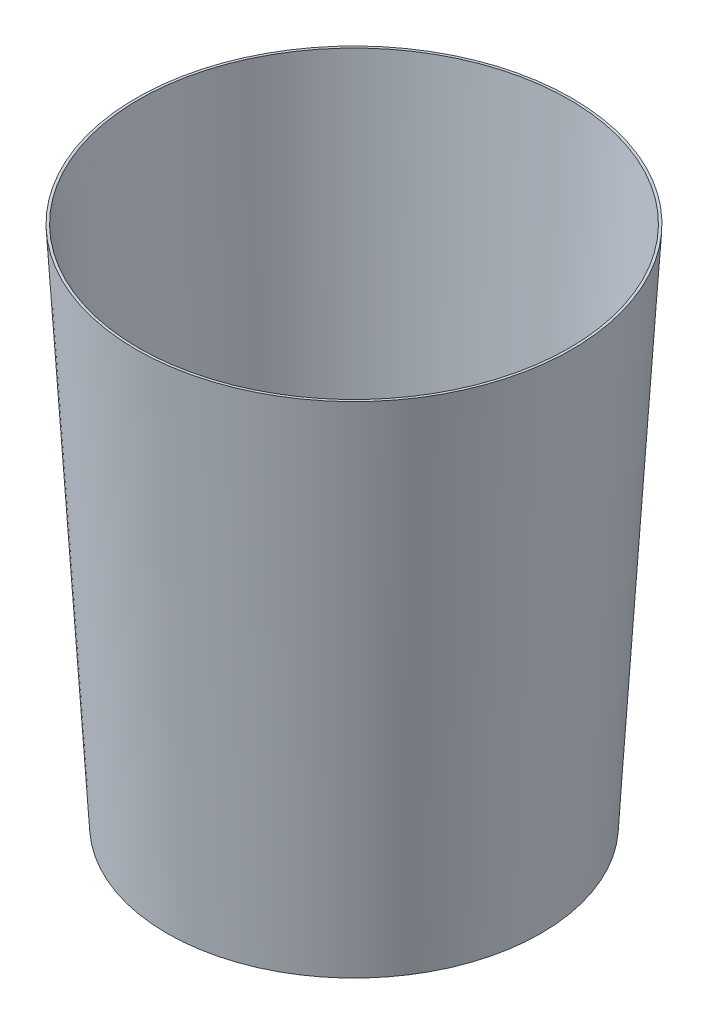
ISO-10303-21;
HEADER;
FILE_DESCRIPTION(('STEP AP214'),'2;1');
FILE_NAME('part.step','',(''),(''),'','','');
FILE_SCHEMA(('AUTOMOTIVE_DESIGN { 1 0 10303 214 1 1 1 1 }'));
ENDSEC;
DATA;
#1=APPLICATION_CONTEXT('core data for automotive mechanical design processes');
#2=APPLICATION_PROTOCOL_DEFINITION('international standard','automotive_design',2000,#1);
#3=PRODUCT_CONTEXT('',#1,'mechanical');
#4=PRODUCT('Part','Part','',(#3));
#5=PRODUCT_RELATED_PRODUCT_CATEGORY('part','',(#4));
#6=PRODUCT_DEFINITION_FORMATION('','',#4);
#7=PRODUCT_DEFINITION_CONTEXT('part definition',#1,'design');
#8=PRODUCT_DEFINITION('design','',#6,#7);
#9=PRODUCT_DEFINITION_SHAPE('','',#8);
#10=(LENGTH_UNIT() NAMED_UNIT(*) SI_UNIT(.MILLI.,.METRE.));
#11=(NAMED_UNIT(*) PLANE_ANGLE_UNIT() SI_UNIT($,.RADIAN.));
#12=(NAMED_UNIT(*) SI_UNIT($,.STERADIAN.) SOLID_ANGLE_UNIT());
#13=UNCERTAINTY_MEASURE_WITH_UNIT(LENGTH_MEASURE(1.E-05),#10,'distance_accuracy_value','');
#14=(GEOMETRIC_REPRESENTATION_CONTEXT(3) GLOBAL_UNCERTAINTY_ASSIGNED_CONTEXT((#13)) GLOBAL_UNIT_ASSIGNED_CONTEXT((#10,
#11,#12)) REPRESENTATION_CONTEXT('',''));
#15=CARTESIAN_POINT('',(0.,0.,0.));
#16=DIRECTION('',(0.,0.,1.));
#17=DIRECTION('',(1.,0.,0.));
#18=AXIS2_PLACEMENT_3D('',#15,#16,#17);
#19=CARTESIAN_POINT('',(0.,-1.778,0.));
#20=DIRECTION('',(0.,1.,0.));
#21=DIRECTION('',(0.,0.,1.));
#22=AXIS2_PLACEMENT_3D('',#19,#20,#21);
#23=PLANE('',#22);
#24=CARTESIAN_POINT('',(0.,-1.778,0.));
#25=DIRECTION('',(0.,1.,0.));
#26=DIRECTION('',(0.,0.,1.));
#27=AXIS2_PLACEMENT_3D('',#24,#25,#26);
#28=CIRCLE('',#27,132.803459140163);
#29=CARTESIAN_POINT('',(0.,-1.778,132.803459140163));
#30=VERTEX_POINT('',#29);
#31=EDGE_CURVE('E86',#30,#30,#28,.T.);
#32=ORIENTED_EDGE('',*,*,#31,.F.);
#33=EDGE_LOOP('',(#32));
#34=FACE_BOUND('',#33,.T.);
#35=ADVANCED_FACE('F78',(#34),#23,.F.);
#36=CARTESIAN_POINT('',(0.,-0.104963856797013,0.));
#37=DIRECTION('',(0.,1.,0.));
#38=DIRECTION('',(1.,0.,0.));
#39=AXIS2_PLACEMENT_3D('',#36,#37,#38);
#40=CONICAL_SURFACE('',#39,132.902399036218,0.0590691344101923);
#41=CARTESIAN_POINT('',(0.,368.3,0.));
#42=DIRECTION('',(0.,1.,0.));
#43=DIRECTION('',(0.,0.,1.));
#44=AXIS2_PLACEMENT_3D('',#41,#42,#43);
#45=CIRCLE('',#44,154.689106381543);
#46=CARTESIAN_POINT('',(0.,368.3,154.689106381543));
#47=VERTEX_POINT('',#46);
#48=EDGE_CURVE('E11',#47,#47,#45,.T.);
#49=ORIENTED_EDGE('',*,*,#48,.F.);
#50=EDGE_LOOP('',(#49));
#51=FACE_BOUND('',#50,.T.);
#52=ORIENTED_EDGE('',*,*,#31,.T.);
#53=EDGE_LOOP('',(#52));
#54=FACE_BOUND('',#53,.T.);
#55=ADVANCED_FACE('F80',(#51,#54),#40,.T.);
#56=CARTESIAN_POINT('',(0.,368.3,0.));
#57=DIRECTION('',(0.,1.,0.));
#58=DIRECTION('',(0.,0.,1.));
#59=AXIS2_PLACEMENT_3D('',#56,#57,#58);
#60=PLANE('',#59);
#61=CARTESIAN_POINT('',(0.,368.3,0.));
#62=DIRECTION('',(0.,1.,0.));
#63=DIRECTION('',(0.,0.,1.));
#64=AXIS2_PLACEMENT_3D('',#61,#62,#63);
#65=CIRCLE('',#64,152.908000000001);
#66=CARTESIAN_POINT('',(0.,368.3,152.908000000001));
#67=VERTEX_POINT('',#66);
#68=EDGE_CURVE('E91',#67,#67,#65,.T.);
#69=ORIENTED_EDGE('',*,*,#68,.F.);
#70=EDGE_LOOP('',(#69));
#71=FACE_BOUND('',#70,.T.);
#72=ORIENTED_EDGE('',*,*,#48,.T.);
#73=EDGE_LOOP('',(#72));
#74=FACE_BOUND('',#73,.T.);
#75=ADVANCED_FACE('F109',(#71,#74),#60,.T.);
#76=CARTESIAN_POINT('',(0.,0.,0.));
#77=DIRECTION('',(0.,1.,0.));
#78=DIRECTION('',(0.,0.,1.));
#79=AXIS2_PLACEMENT_3D('',#76,#77,#78);
#80=PLANE('',#79);
#81=CARTESIAN_POINT('',(0.,0.,0.));
#82=DIRECTION('',(0.,1.,0.));
#83=DIRECTION('',(1.,0.,0.));
#84=AXIS2_PLACEMENT_3D('',#81,#82,#83);
#85=CIRCLE('',#84,131.1275);
#86=CARTESIAN_POINT('',(131.1275,0.,0.));
#87=VERTEX_POINT('',#86);
#88=EDGE_CURVE('E96',#87,#87,#85,.T.);
#89=ORIENTED_EDGE('',*,*,#88,.T.);
#90=EDGE_LOOP('',(#89));
#91=FACE_BOUND('',#90,.T.);
#92=ADVANCED_FACE('F103',(#91),#80,.T.);
#93=CARTESIAN_POINT('',(0.,0.,0.));
#94=DIRECTION('',(0.,1.,0.));
#95=DIRECTION('',(1.,0.,0.));
#96=AXIS2_PLACEMENT_3D('',#93,#94,#95);
#97=CONICAL_SURFACE('',#96,131.1275,0.0590691344101923);
#98=ORIENTED_EDGE('',*,*,#68,.T.);
#99=EDGE_LOOP('',(#98));
#100=FACE_BOUND('',#99,.T.);
#101=ORIENTED_EDGE('',*,*,#88,.F.);
#102=EDGE_LOOP('',(#101));
#103=FACE_BOUND('',#102,.T.);
#104=ADVANCED_FACE('F105',(#100,#103),#97,.F.);
#105=CLOSED_SHELL('',(#35,#55,#75,#92,#104));
#106=MANIFOLD_SOLID_BREP('B2',#105);
#107=ADVANCED_BREP_SHAPE_REPRESENTATION('',(#18,#106),#14);
#108=SHAPE_DEFINITION_REPRESENTATION(#9,#107);
ENDSEC;
END-ISO-10303-21;
